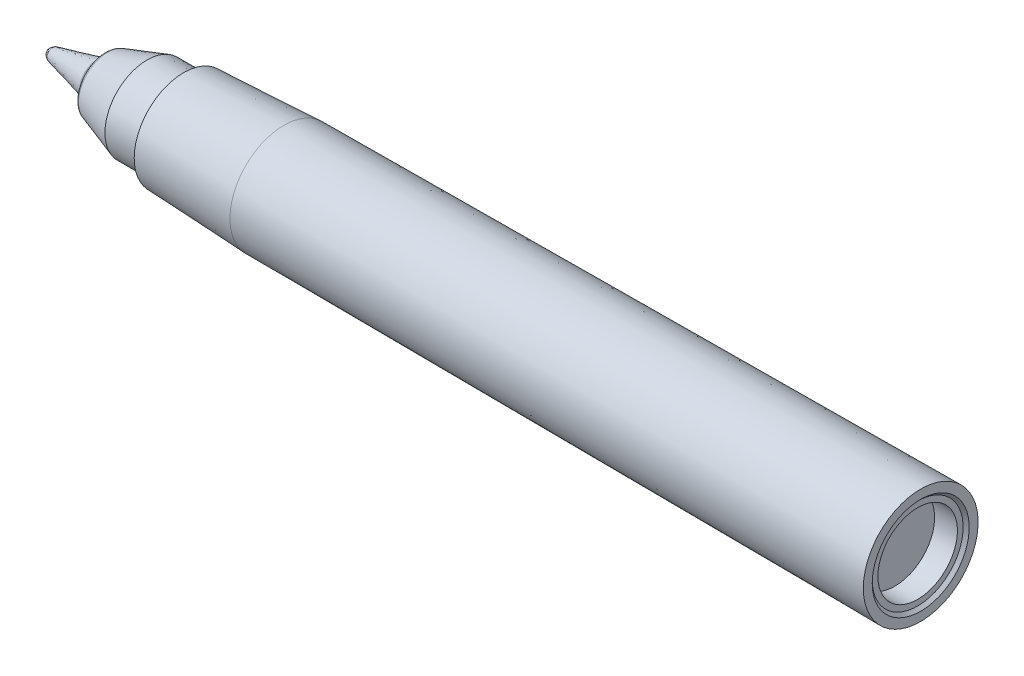
ISO-10303-21;
HEADER;
FILE_DESCRIPTION(('STEP AP214'),'2;1');
FILE_NAME('part.step','',(''),(''),'','','');
FILE_SCHEMA(('AUTOMOTIVE_DESIGN { 1 0 10303 214 1 1 1 1 }'));
ENDSEC;
DATA;
#1=APPLICATION_CONTEXT('core data for automotive mechanical design processes');
#2=APPLICATION_PROTOCOL_DEFINITION('international standard','automotive_design',2000,#1);
#3=PRODUCT_CONTEXT('',#1,'mechanical');
#4=PRODUCT('Part','Part','',(#3));
#5=PRODUCT_RELATED_PRODUCT_CATEGORY('part','',(#4));
#6=PRODUCT_DEFINITION_FORMATION('','',#4);
#7=PRODUCT_DEFINITION_CONTEXT('part definition',#1,'design');
#8=PRODUCT_DEFINITION('design','',#6,#7);
#9=PRODUCT_DEFINITION_SHAPE('','',#8);
#10=(LENGTH_UNIT() NAMED_UNIT(*) SI_UNIT(.MILLI.,.METRE.));
#11=(NAMED_UNIT(*) PLANE_ANGLE_UNIT() SI_UNIT($,.RADIAN.));
#12=(NAMED_UNIT(*) SI_UNIT($,.STERADIAN.) SOLID_ANGLE_UNIT());
#13=UNCERTAINTY_MEASURE_WITH_UNIT(LENGTH_MEASURE(1.E-05),#10,'distance_accuracy_value','');
#14=(GEOMETRIC_REPRESENTATION_CONTEXT(3) GLOBAL_UNCERTAINTY_ASSIGNED_CONTEXT((#13)) GLOBAL_UNIT_ASSIGNED_CONTEXT((#10,
#11,#12)) REPRESENTATION_CONTEXT('',''));
#15=CARTESIAN_POINT('',(0.,0.,0.));
#16=DIRECTION('',(0.,0.,1.));
#17=DIRECTION('',(1.,0.,0.));
#18=AXIS2_PLACEMENT_3D('',#15,#16,#17);
#19=CARTESIAN_POINT('',(8.50261962837269,0.,0.));
#20=DIRECTION('',(-1.,0.,0.));
#21=DIRECTION('',(0.,-1.,0.));
#22=AXIS2_PLACEMENT_3D('',#19,#20,#21);
#23=CYLINDRICAL_SURFACE('',#22,1.09999999999991);
#24=CARTESIAN_POINT('',(8.50261962837794,0.,0.));
#25=DIRECTION('',(-1.,0.,0.));
#26=DIRECTION('',(0.,-1.,0.));
#27=AXIS2_PLACEMENT_3D('',#24,#25,#26);
#28=CIRCLE('',#27,1.09999999999991);
#29=CARTESIAN_POINT('',(8.50261962837794,-1.09999999999991,0.));
#30=VERTEX_POINT('',#29);
#31=EDGE_CURVE('E11',#30,#30,#28,.T.);
#32=ORIENTED_EDGE('',*,*,#31,.F.);
#33=EDGE_LOOP('',(#32));
#34=FACE_BOUND('',#33,.T.);
#35=CARTESIAN_POINT('',(4.51671057128805,0.,0.));
#36=DIRECTION('',(-1.,0.,0.));
#37=DIRECTION('',(0.,-1.,0.));
#38=AXIS2_PLACEMENT_3D('',#35,#36,#37);
#39=CIRCLE('',#38,1.09999999999991);
#40=CARTESIAN_POINT('',(4.51671057128805,-1.09999999999991,0.));
#41=VERTEX_POINT('',#40);
#42=EDGE_CURVE('E94',#41,#41,#39,.T.);
#43=ORIENTED_EDGE('',*,*,#42,.T.);
#44=EDGE_LOOP('',(#43));
#45=FACE_BOUND('',#44,.T.);
#46=ADVANCED_FACE('F49',(#34,#45),#23,.F.);
#47=CARTESIAN_POINT('',(8.50261962837531,0.,0.));
#48=DIRECTION('',(1.,0.,0.));
#49=DIRECTION('',(0.,1.,0.));
#50=AXIS2_PLACEMENT_3D('',#47,#48,#49);
#51=PLANE('',#50);
#52=ORIENTED_EDGE('',*,*,#31,.T.);
#53=EDGE_LOOP('',(#52));
#54=FACE_BOUND('',#53,.T.);
#55=ADVANCED_FACE('F150',(#54),#51,.F.);
#56=CARTESIAN_POINT('',(55.7113816910496,2.61437275918934,0.));
#57=DIRECTION('',(-1.,0.,0.));
#58=DIRECTION('',(0.,-1.,0.));
#59=AXIS2_PLACEMENT_3D('',#56,#57,#58);
#60=PLANE('',#59);
#61=CARTESIAN_POINT('',(55.7113816910496,0.,0.));
#62=DIRECTION('',(-1.,0.,0.));
#63=DIRECTION('',(0.,-1.,0.));
#64=AXIS2_PLACEMENT_3D('',#61,#62,#63);
#65=CIRCLE('',#64,2.61437275918934);
#66=CARTESIAN_POINT('',(55.7113816910496,-2.61437275918934,0.));
#67=VERTEX_POINT('',#66);
#68=EDGE_CURVE('E56',#67,#67,#65,.T.);
#69=ORIENTED_EDGE('',*,*,#68,.F.);
#70=EDGE_LOOP('',(#69));
#71=FACE_BOUND('',#70,.T.);
#72=ADVANCED_FACE('F145',(#71),#60,.F.);
#73=CARTESIAN_POINT('',(55.5113816910399,0.,0.));
#74=DIRECTION('',(-1.,0.,0.));
#75=DIRECTION('',(0.,-1.,0.));
#76=AXIS2_PLACEMENT_3D('',#73,#74,#75);
#77=TOROIDAL_SURFACE('',#76,2.61437275917972,0.200000000009678);
#78=CARTESIAN_POINT('',(55.510774492981,0.,0.));
#79=DIRECTION('',(-1.,0.,0.));
#80=DIRECTION('',(0.,-1.,0.));
#81=AXIS2_PLACEMENT_3D('',#78,#79,#80);
#82=CIRCLE('',#81,2.81437183746357);
#83=CARTESIAN_POINT('',(55.510774492981,-2.81437183746357,0.));
#84=VERTEX_POINT('',#83);
#85=EDGE_CURVE('E62',#84,#84,#82,.T.);
#86=ORIENTED_EDGE('',*,*,#85,.F.);
#87=EDGE_LOOP('',(#86));
#88=FACE_BOUND('',#87,.T.);
#89=ORIENTED_EDGE('',*,*,#68,.T.);
#90=EDGE_LOOP('',(#89));
#91=FACE_BOUND('',#90,.T.);
#92=ADVANCED_FACE('F140',(#88,#91),#77,.T.);
#93=CARTESIAN_POINT('',(55.510774492981,0.,0.));
#94=DIRECTION('',(1.,0.,0.));
#95=DIRECTION('',(0.,1.,0.));
#96=AXIS2_PLACEMENT_3D('',#93,#94,#95);
#97=CONICAL_SURFACE('',#96,2.81437183746357,0.00422017130486288);
#98=CARTESIAN_POINT('',(31.133148246512,0.,0.));
#99=DIRECTION('',(-1.,0.,0.));
#100=DIRECTION('',(0.,-1.,0.));
#101=AXIS2_PLACEMENT_3D('',#98,#99,#100);
#102=CIRCLE('',#101,2.71149346794752);
#103=CARTESIAN_POINT('',(31.133148246512,-2.71149346794752,0.));
#104=VERTEX_POINT('',#103);
#105=EDGE_CURVE('E68',#104,#104,#102,.T.);
#106=ORIENTED_EDGE('',*,*,#105,.F.);
#107=EDGE_LOOP('',(#106));
#108=FACE_BOUND('',#107,.T.);
#109=ORIENTED_EDGE('',*,*,#85,.T.);
#110=EDGE_LOOP('',(#109));
#111=FACE_BOUND('',#110,.T.);
#112=ADVANCED_FACE('F134',(#108,#111),#97,.T.);
#113=CARTESIAN_POINT('',(25.5505978630776,0.,0.));
#114=DIRECTION('',(-1.,0.,0.));
#115=DIRECTION('',(0.,-1.,0.));
#116=AXIS2_PLACEMENT_3D('',#113,#114,#115);
#117=DEGENERATE_TOROIDAL_SURFACE('',#116,318.3748413353,321.13486149306,.F.);
#118=CARTESIAN_POINT('',(10.9274143015883,0.,0.));
#119=DIRECTION('',(-1.,0.,0.));
#120=DIRECTION('',(0.,-1.,0.));
#121=AXIS2_PLACEMENT_3D('',#118,#119,#120);
#122=CIRCLE('',#121,2.42690705253801);
#123=CARTESIAN_POINT('',(10.9274143015883,-2.42690705253801,0.));
#124=VERTEX_POINT('',#123);
#125=EDGE_CURVE('E74',#124,#124,#122,.T.);
#126=ORIENTED_EDGE('',*,*,#125,.F.);
#127=EDGE_LOOP('',(#126));
#128=FACE_BOUND('',#127,.T.);
#129=ORIENTED_EDGE('',*,*,#105,.T.);
#130=EDGE_LOOP('',(#129));
#131=FACE_BOUND('',#130,.T.);
#132=ADVANCED_FACE('F128',(#128,#131),#117,.F.);
#133=CARTESIAN_POINT('',(8.50261962837269,0.,0.));
#134=DIRECTION('',(-1.,0.,0.));
#135=DIRECTION('',(0.,-1.,0.));
#136=AXIS2_PLACEMENT_3D('',#133,#134,#135);
#137=CYLINDRICAL_SURFACE('',#136,2.42690705253955);
#138=CARTESIAN_POINT('',(9.70052193133052,0.,0.));
#139=DIRECTION('',(-1.,0.,0.));
#140=DIRECTION('',(0.,-1.,0.));
#141=AXIS2_PLACEMENT_3D('',#138,#139,#140);
#142=CIRCLE('',#141,2.42690705254109);
#143=CARTESIAN_POINT('',(9.70052193133052,-2.42690705254109,0.));
#144=VERTEX_POINT('',#143);
#145=EDGE_CURVE('E78',#144,#144,#142,.T.);
#146=ORIENTED_EDGE('',*,*,#145,.F.);
#147=EDGE_LOOP('',(#146));
#148=FACE_BOUND('',#147,.T.);
#149=ORIENTED_EDGE('',*,*,#125,.T.);
#150=EDGE_LOOP('',(#149));
#151=FACE_BOUND('',#150,.T.);
#152=ADVANCED_FACE('F122',(#148,#151),#137,.T.);
#153=CARTESIAN_POINT('',(9.70052193133052,2.19852355134617,0.));
#154=DIRECTION('',(1.,0.,0.));
#155=DIRECTION('',(0.,1.,0.));
#156=AXIS2_PLACEMENT_3D('',#153,#154,#155);
#157=PLANE('',#156);
#158=CARTESIAN_POINT('',(9.70052193133052,0.,0.));
#159=DIRECTION('',(-1.,0.,0.));
#160=DIRECTION('',(0.,-1.,0.));
#161=AXIS2_PLACEMENT_3D('',#158,#159,#160);
#162=CIRCLE('',#161,2.19852355134617);
#163=CARTESIAN_POINT('',(9.70052193133052,-2.19852355134617,0.));
#164=VERTEX_POINT('',#163);
#165=EDGE_CURVE('E82',#164,#164,#162,.T.);
#166=ORIENTED_EDGE('',*,*,#165,.F.);
#167=EDGE_LOOP('',(#166));
#168=FACE_BOUND('',#167,.T.);
#169=ORIENTED_EDGE('',*,*,#145,.T.);
#170=EDGE_LOOP('',(#169));
#171=FACE_BOUND('',#170,.T.);
#172=ADVANCED_FACE('F116',(#168,#171),#157,.F.);
#173=CARTESIAN_POINT('',(8.50261962837269,0.,0.));
#174=DIRECTION('',(-1.,0.,0.));
#175=DIRECTION('',(0.,-1.,0.));
#176=AXIS2_PLACEMENT_3D('',#173,#174,#175);
#177=CYLINDRICAL_SURFACE('',#176,2.19852355134617);
#178=CARTESIAN_POINT('',(6.95810440082095,0.,0.));
#179=DIRECTION('',(-1.,0.,0.));
#180=DIRECTION('',(0.,-1.,0.));
#181=AXIS2_PLACEMENT_3D('',#178,#179,#180);
#182=CIRCLE('',#181,2.19852355134617);
#183=CARTESIAN_POINT('',(6.95810440082095,-2.19852355134617,0.));
#184=VERTEX_POINT('',#183);
#185=EDGE_CURVE('E86',#184,#184,#182,.T.);
#186=ORIENTED_EDGE('',*,*,#185,.F.);
#187=EDGE_LOOP('',(#186));
#188=FACE_BOUND('',#187,.T.);
#189=ORIENTED_EDGE('',*,*,#165,.T.);
#190=EDGE_LOOP('',(#189));
#191=FACE_BOUND('',#190,.T.);
#192=ADVANCED_FACE('F110',(#188,#191),#177,.T.);
#193=CARTESIAN_POINT('',(6.95810440082095,0.,0.));
#194=DIRECTION('',(1.,0.,0.));
#195=DIRECTION('',(0.,1.,0.));
#196=AXIS2_PLACEMENT_3D('',#193,#194,#195);
#197=CONICAL_SURFACE('',#196,2.19852355134617,0.35208343751288);
#198=CARTESIAN_POINT('',(4.51671057128805,0.,0.));
#199=DIRECTION('',(-1.,0.,0.));
#200=DIRECTION('',(0.,-1.,0.));
#201=AXIS2_PLACEMENT_3D('',#198,#199,#200);
#202=CIRCLE('',#201,1.30157659585847);
#203=CARTESIAN_POINT('',(4.51671057128805,-1.30157659585847,0.));
#204=VERTEX_POINT('',#203);
#205=EDGE_CURVE('E90',#204,#204,#202,.T.);
#206=ORIENTED_EDGE('',*,*,#205,.F.);
#207=EDGE_LOOP('',(#206));
#208=FACE_BOUND('',#207,.T.);
#209=ORIENTED_EDGE('',*,*,#185,.T.);
#210=EDGE_LOOP('',(#209));
#211=FACE_BOUND('',#210,.T.);
#212=ADVANCED_FACE('F104',(#208,#211),#197,.T.);
#213=CARTESIAN_POINT('',(4.51671057128805,1.09999999999991,0.));
#214=DIRECTION('',(1.,0.,0.));
#215=DIRECTION('',(0.,1.,0.));
#216=AXIS2_PLACEMENT_3D('',#213,#214,#215);
#217=PLANE('',#216);
#218=ORIENTED_EDGE('',*,*,#42,.F.);
#219=EDGE_LOOP('',(#218));
#220=FACE_BOUND('',#219,.T.);
#221=ORIENTED_EDGE('',*,*,#205,.T.);
#222=EDGE_LOOP('',(#221));
#223=FACE_BOUND('',#222,.T.);
#224=ADVANCED_FACE('F101',(#220,#223),#217,.F.);
#225=CLOSED_SHELL('',(#46,#55,#72,#92,#112,#132,#152,#172,#192,#212,#224));
#226=MANIFOLD_SOLID_BREP('B2',#225);
#227=CARTESIAN_POINT('',(3.71138169106612,1.63313727629748,0.));
#228=DIRECTION('',(1.,0.,0.));
#229=DIRECTION('',(0.,0.,-1.));
#230=AXIS2_PLACEMENT_3D('',#227,#228,#229);
#231=PLANE('',#230);
#232=CARTESIAN_POINT('',(3.71138169104961,0.,0.));
#233=DIRECTION('',(-1.,0.,0.));
#234=DIRECTION('',(0.,0.,1.));
#235=AXIS2_PLACEMENT_3D('',#232,#233,#234);
#236=CIRCLE('',#235,1.09999999999991);
#237=CARTESIAN_POINT('',(3.71138169104961,0.,1.09999999999991));
#238=VERTEX_POINT('',#237);
#239=EDGE_CURVE('E345',#238,#238,#236,.T.);
#240=ORIENTED_EDGE('',*,*,#239,.F.);
#241=EDGE_LOOP('',(#240));
#242=FACE_BOUND('',#241,.T.);
#243=CARTESIAN_POINT('',(3.71138169108264,0.,0.));
#244=DIRECTION('',(-1.,0.,0.));
#245=DIRECTION('',(0.,0.,1.));
#246=AXIS2_PLACEMENT_3D('',#243,#244,#245);
#247=CIRCLE('',#246,1.63313727629748);
#248=CARTESIAN_POINT('',(3.71138169108264,0.,1.63313727629748));
#249=VERTEX_POINT('',#248);
#250=EDGE_CURVE('E48',#249,#249,#247,.T.);
#251=ORIENTED_EDGE('',*,*,#250,.T.);
#252=EDGE_LOOP('',(#251));
#253=FACE_BOUND('',#252,.T.);
#254=ADVANCED_FACE('F260',(#242,#253),#231,.F.);
#255=CARTESIAN_POINT('',(4.01138169108235,0.,0.));
#256=DIRECTION('',(-1.,0.,0.));
#257=DIRECTION('',(0.,0.,1.));
#258=AXIS2_PLACEMENT_3D('',#255,#256,#257);
#259=TOROIDAL_SURFACE('',#258,1.63313727629763,0.299999999999717);
#260=ORIENTED_EDGE('',*,*,#250,.F.);
#261=EDGE_LOOP('',(#260));
#262=FACE_BOUND('',#261,.T.);
#263=CARTESIAN_POINT('',(3.91727671553044,0.,0.));
#264=DIRECTION('',(-1.,0.,0.));
#265=DIRECTION('',(0.,0.,1.));
#266=AXIS2_PLACEMENT_3D('',#263,#264,#265);
#267=CIRCLE('',#266,1.91799558068106);
#268=CARTESIAN_POINT('',(3.91727671553044,0.,1.91799558068106));
#269=VERTEX_POINT('',#268);
#270=EDGE_CURVE('E267',#269,#269,#267,.T.);
#271=ORIENTED_EDGE('',*,*,#270,.T.);
#272=EDGE_LOOP('',(#271));
#273=FACE_BOUND('',#272,.T.);
#274=ADVANCED_FACE('F354',(#262,#273),#259,.T.);
#275=CARTESIAN_POINT('',(6.51138169111982,0.,0.));
#276=DIRECTION('',(1.,0.,0.));
#277=DIRECTION('',(0.,0.,-1.));
#278=AXIS2_PLACEMENT_3D('',#275,#276,#277);
#279=CONICAL_SURFACE('',#278,2.77497668867727,0.319069595668549);
#280=ORIENTED_EDGE('',*,*,#270,.F.);
#281=EDGE_LOOP('',(#280));
#282=FACE_BOUND('',#281,.T.);
#283=CARTESIAN_POINT('',(6.51138169111982,0.,0.));
#284=DIRECTION('',(-1.,0.,0.));
#285=DIRECTION('',(0.,0.,1.));
#286=AXIS2_PLACEMENT_3D('',#283,#284,#285);
#287=CIRCLE('',#286,2.77497668867727);
#288=CARTESIAN_POINT('',(6.51138169111982,0.,2.77497668867727));
#289=VERTEX_POINT('',#288);
#290=EDGE_CURVE('E273',#289,#289,#287,.T.);
#291=ORIENTED_EDGE('',*,*,#290,.T.);
#292=EDGE_LOOP('',(#291));
#293=FACE_BOUND('',#292,.T.);
#294=ADVANCED_FACE('F358',(#282,#293),#279,.T.);
#295=CARTESIAN_POINT('',(8.91138169108489,0.,0.));
#296=DIRECTION('',(1.,0.,0.));
#297=DIRECTION('',(0.,0.,-1.));
#298=AXIS2_PLACEMENT_3D('',#295,#296,#297);
#299=CONICAL_SURFACE('',#298,2.7899766886776,0.00624991862192917);
#300=ORIENTED_EDGE('',*,*,#290,.F.);
#301=EDGE_LOOP('',(#300));
#302=FACE_BOUND('',#301,.T.);
#303=CARTESIAN_POINT('',(8.91138169108489,0.,0.));
#304=DIRECTION('',(-1.,0.,0.));
#305=DIRECTION('',(0.,0.,1.));
#306=AXIS2_PLACEMENT_3D('',#303,#304,#305);
#307=CIRCLE('',#306,2.7899766886776);
#308=CARTESIAN_POINT('',(8.91138169108489,0.,2.7899766886776));
#309=VERTEX_POINT('',#308);
#310=EDGE_CURVE('E279',#309,#309,#307,.T.);
#311=ORIENTED_EDGE('',*,*,#310,.T.);
#312=EDGE_LOOP('',(#311));
#313=FACE_BOUND('',#312,.T.);
#314=ADVANCED_FACE('F363',(#302,#313),#299,.T.);
#315=CARTESIAN_POINT('',(8.91138169108489,3.24997668867763,0.));
#316=DIRECTION('',(1.,0.,0.));
#317=DIRECTION('',(0.,0.,-1.));
#318=AXIS2_PLACEMENT_3D('',#315,#316,#317);
#319=PLANE('',#318);
#320=ORIENTED_EDGE('',*,*,#310,.F.);
#321=EDGE_LOOP('',(#320));
#322=FACE_BOUND('',#321,.T.);
#323=CARTESIAN_POINT('',(8.91138169108489,0.,0.));
#324=DIRECTION('',(-1.,0.,0.));
#325=DIRECTION('',(0.,0.,1.));
#326=AXIS2_PLACEMENT_3D('',#323,#324,#325);
#327=CIRCLE('',#326,3.24997668867763);
#328=CARTESIAN_POINT('',(8.91138169108489,0.,3.24997668867763));
#329=VERTEX_POINT('',#328);
#330=EDGE_CURVE('E285',#329,#329,#327,.T.);
#331=ORIENTED_EDGE('',*,*,#330,.T.);
#332=EDGE_LOOP('',(#331));
#333=FACE_BOUND('',#332,.T.);
#334=ADVANCED_FACE('F369',(#322,#333),#319,.F.);
#335=CARTESIAN_POINT('',(15.5113816910853,0.,0.));
#336=DIRECTION('',(1.,0.,0.));
#337=DIRECTION('',(0.,0.,-1.));
#338=AXIS2_PLACEMENT_3D('',#335,#336,#337);
#339=CONICAL_SURFACE('',#338,3.54997668867828,0.0454232794216723);
#340=ORIENTED_EDGE('',*,*,#330,.F.);
#341=EDGE_LOOP('',(#340));
#342=FACE_BOUND('',#341,.T.);
#343=CARTESIAN_POINT('',(15.5113816910853,0.,0.));
#344=DIRECTION('',(-1.,0.,0.));
#345=DIRECTION('',(0.,0.,1.));
#346=AXIS2_PLACEMENT_3D('',#343,#344,#345);
#347=CIRCLE('',#346,3.54997668867828);
#348=CARTESIAN_POINT('',(15.5113816910853,0.,3.54997668867828));
#349=VERTEX_POINT('',#348);
#350=EDGE_CURVE('E289',#349,#349,#347,.T.);
#351=ORIENTED_EDGE('',*,*,#350,.T.);
#352=EDGE_LOOP('',(#351));
#353=FACE_BOUND('',#352,.T.);
#354=ADVANCED_FACE('F373',(#342,#353),#339,.T.);
#355=CARTESIAN_POINT('',(57.4113816910467,0.,0.));
#356=DIRECTION('',(1.,0.,0.));
#357=DIRECTION('',(0.,0.,-1.));
#358=AXIS2_PLACEMENT_3D('',#355,#356,#357);
#359=CONICAL_SURFACE('',#358,3.77605582537217,0.00539563109200447);
#360=ORIENTED_EDGE('',*,*,#350,.F.);
#361=EDGE_LOOP('',(#360));
#362=FACE_BOUND('',#361,.T.);
#363=CARTESIAN_POINT('',(57.4113816910467,0.,0.));
#364=DIRECTION('',(-1.,0.,0.));
#365=DIRECTION('',(0.,0.,1.));
#366=AXIS2_PLACEMENT_3D('',#363,#364,#365);
#367=CIRCLE('',#366,3.77605582537217);
#368=CARTESIAN_POINT('',(57.4113816910467,0.,3.77605582537217));
#369=VERTEX_POINT('',#368);
#370=EDGE_CURVE('E293',#369,#369,#367,.T.);
#371=ORIENTED_EDGE('',*,*,#370,.T.);
#372=EDGE_LOOP('',(#371));
#373=FACE_BOUND('',#372,.T.);
#374=ADVANCED_FACE('F377',(#362,#373),#359,.T.);
#375=CARTESIAN_POINT('',(57.4113816910451,3.19137086155206,0.));
#376=DIRECTION('',(-1.,0.,0.));
#377=DIRECTION('',(0.,0.,1.));
#378=AXIS2_PLACEMENT_3D('',#375,#376,#377);
#379=PLANE('',#378);
#380=ORIENTED_EDGE('',*,*,#370,.F.);
#381=EDGE_LOOP('',(#380));
#382=FACE_BOUND('',#381,.T.);
#383=CARTESIAN_POINT('',(57.4113816910435,0.,0.));
#384=DIRECTION('',(-1.,0.,0.));
#385=DIRECTION('',(0.,0.,1.));
#386=AXIS2_PLACEMENT_3D('',#383,#384,#385);
#387=CIRCLE('',#386,3.19137086155206);
#388=CARTESIAN_POINT('',(57.4113816910435,0.,3.19137086155206));
#389=VERTEX_POINT('',#388);
#390=EDGE_CURVE('E297',#389,#389,#387,.T.);
#391=ORIENTED_EDGE('',*,*,#390,.T.);
#392=EDGE_LOOP('',(#391));
#393=FACE_BOUND('',#392,.T.);
#394=ADVANCED_FACE('F381',(#382,#393),#379,.F.);
#395=CARTESIAN_POINT('',(57.2113816910496,0.,0.));
#396=DIRECTION('',(1.,0.,0.));
#397=DIRECTION('',(0.,0.,-1.));
#398=AXIS2_PLACEMENT_3D('',#395,#396,#397);
#399=CONICAL_SURFACE('',#398,2.99137086155815,0.785398163397483);
#400=ORIENTED_EDGE('',*,*,#390,.F.);
#401=EDGE_LOOP('',(#400));
#402=FACE_BOUND('',#401,.T.);
#403=CARTESIAN_POINT('',(57.2113816910496,0.,0.));
#404=DIRECTION('',(-1.,0.,0.));
#405=DIRECTION('',(0.,0.,1.));
#406=AXIS2_PLACEMENT_3D('',#403,#404,#405);
#407=CIRCLE('',#406,2.99137086155815);
#408=CARTESIAN_POINT('',(57.2113816910496,0.,2.99137086155815));
#409=VERTEX_POINT('',#408);
#410=EDGE_CURVE('E301',#409,#409,#407,.T.);
#411=ORIENTED_EDGE('',*,*,#410,.T.);
#412=EDGE_LOOP('',(#411));
#413=FACE_BOUND('',#412,.T.);
#414=ADVANCED_FACE('F385',(#402,#413),#399,.F.);
#415=CARTESIAN_POINT('',(57.2113816910496,2.61437275918934,0.));
#416=DIRECTION('',(-1.,0.,0.));
#417=DIRECTION('',(0.,0.,1.));
#418=AXIS2_PLACEMENT_3D('',#415,#416,#417);
#419=PLANE('',#418);
#420=ORIENTED_EDGE('',*,*,#410,.F.);
#421=EDGE_LOOP('',(#420));
#422=FACE_BOUND('',#421,.T.);
#423=CARTESIAN_POINT('',(57.2113816910496,0.,0.));
#424=DIRECTION('',(-1.,0.,0.));
#425=DIRECTION('',(0.,0.,1.));
#426=AXIS2_PLACEMENT_3D('',#423,#424,#425);
#427=CIRCLE('',#426,2.61437275918934);
#428=CARTESIAN_POINT('',(57.2113816910496,0.,2.61437275918934));
#429=VERTEX_POINT('',#428);
#430=EDGE_CURVE('E305',#429,#429,#427,.T.);
#431=ORIENTED_EDGE('',*,*,#430,.T.);
#432=EDGE_LOOP('',(#431));
#433=FACE_BOUND('',#432,.T.);
#434=ADVANCED_FACE('F389',(#422,#433),#419,.F.);
#435=CARTESIAN_POINT('',(0.,0.,0.));
#436=DIRECTION('',(-1.,0.,0.));
#437=DIRECTION('',(0.,0.,1.));
#438=AXIS2_PLACEMENT_3D('',#435,#436,#437);
#439=CYLINDRICAL_SURFACE('',#438,2.61437275918934);
#440=ORIENTED_EDGE('',*,*,#430,.F.);
#441=EDGE_LOOP('',(#440));
#442=FACE_BOUND('',#441,.T.);
#443=CARTESIAN_POINT('',(55.7113816910496,0.,0.));
#444=DIRECTION('',(-1.,0.,0.));
#445=DIRECTION('',(0.,0.,1.));
#446=AXIS2_PLACEMENT_3D('',#443,#444,#445);
#447=CIRCLE('',#446,2.61437275918934);
#448=CARTESIAN_POINT('',(55.7113816910496,0.,2.61437275918934));
#449=VERTEX_POINT('',#448);
#450=EDGE_CURVE('E309',#449,#449,#447,.T.);
#451=ORIENTED_EDGE('',*,*,#450,.T.);
#452=EDGE_LOOP('',(#451));
#453=FACE_BOUND('',#452,.T.);
#454=ADVANCED_FACE('F393',(#442,#453),#439,.F.);
#455=CARTESIAN_POINT('',(55.5113816910399,0.,0.));
#456=DIRECTION('',(-1.,0.,0.));
#457=DIRECTION('',(0.,0.,1.));
#458=AXIS2_PLACEMENT_3D('',#455,#456,#457);
#459=TOROIDAL_SURFACE('',#458,2.61437275917972,0.200000000009678);
#460=ORIENTED_EDGE('',*,*,#450,.F.);
#461=EDGE_LOOP('',(#460));
#462=FACE_BOUND('',#461,.T.);
#463=CARTESIAN_POINT('',(55.510774492981,0.,0.));
#464=DIRECTION('',(-1.,0.,0.));
#465=DIRECTION('',(0.,0.,1.));
#466=AXIS2_PLACEMENT_3D('',#463,#464,#465);
#467=CIRCLE('',#466,2.81437183746357);
#468=CARTESIAN_POINT('',(55.510774492981,0.,2.81437183746357));
#469=VERTEX_POINT('',#468);
#470=EDGE_CURVE('E313',#469,#469,#467,.T.);
#471=ORIENTED_EDGE('',*,*,#470,.T.);
#472=EDGE_LOOP('',(#471));
#473=FACE_BOUND('',#472,.T.);
#474=ADVANCED_FACE('F397',(#462,#473),#459,.F.);
#475=CARTESIAN_POINT('',(31.1331482465121,0.,0.));
#476=DIRECTION('',(1.,0.,0.));
#477=DIRECTION('',(0.,0.,-1.));
#478=AXIS2_PLACEMENT_3D('',#475,#476,#477);
#479=CONICAL_SURFACE('',#478,2.71149346794436,0.00422017130499267);
#480=ORIENTED_EDGE('',*,*,#470,.F.);
#481=EDGE_LOOP('',(#480));
#482=FACE_BOUND('',#481,.T.);
#483=CARTESIAN_POINT('',(31.1331482465121,0.,0.));
#484=DIRECTION('',(-1.,0.,0.));
#485=DIRECTION('',(0.,0.,1.));
#486=AXIS2_PLACEMENT_3D('',#483,#484,#485);
#487=CIRCLE('',#486,2.71149346794436);
#488=CARTESIAN_POINT('',(31.1331482465121,0.,2.71149346794436));
#489=VERTEX_POINT('',#488);
#490=EDGE_CURVE('E317',#489,#489,#487,.T.);
#491=ORIENTED_EDGE('',*,*,#490,.T.);
#492=EDGE_LOOP('',(#491));
#493=FACE_BOUND('',#492,.T.);
#494=ADVANCED_FACE('F401',(#482,#493),#479,.F.);
#495=CARTESIAN_POINT('',(25.5505978630776,0.,0.));
#496=DIRECTION('',(-1.,0.,0.));
#497=DIRECTION('',(0.,0.,1.));
#498=AXIS2_PLACEMENT_3D('',#495,#496,#497);
#499=DEGENERATE_TOROIDAL_SURFACE('',#498,318.3748413353,321.13486149306,.F.);
#500=ORIENTED_EDGE('',*,*,#490,.F.);
#501=EDGE_LOOP('',(#500));
#502=FACE_BOUND('',#501,.T.);
#503=CARTESIAN_POINT('',(10.9274143015883,0.,0.));
#504=DIRECTION('',(-1.,0.,0.));
#505=DIRECTION('',(0.,0.,1.));
#506=AXIS2_PLACEMENT_3D('',#503,#504,#505);
#507=CIRCLE('',#506,2.42690705253801);
#508=CARTESIAN_POINT('',(10.9274143015883,0.,2.42690705253801));
#509=VERTEX_POINT('',#508);
#510=EDGE_CURVE('E321',#509,#509,#507,.T.);
#511=ORIENTED_EDGE('',*,*,#510,.T.);
#512=EDGE_LOOP('',(#511));
#513=FACE_BOUND('',#512,.T.);
#514=ADVANCED_FACE('F405',(#502,#513),#499,.T.);
#515=CARTESIAN_POINT('',(0.,0.,0.));
#516=DIRECTION('',(-1.,0.,0.));
#517=DIRECTION('',(0.,0.,1.));
#518=AXIS2_PLACEMENT_3D('',#515,#516,#517);
#519=CYLINDRICAL_SURFACE('',#518,2.42690705253955);
#520=ORIENTED_EDGE('',*,*,#510,.F.);
#521=EDGE_LOOP('',(#520));
#522=FACE_BOUND('',#521,.T.);
#523=CARTESIAN_POINT('',(9.70052193133052,0.,0.));
#524=DIRECTION('',(-1.,0.,0.));
#525=DIRECTION('',(0.,0.,1.));
#526=AXIS2_PLACEMENT_3D('',#523,#524,#525);
#527=CIRCLE('',#526,2.42690705254109);
#528=CARTESIAN_POINT('',(9.70052193133052,0.,2.42690705254109));
#529=VERTEX_POINT('',#528);
#530=EDGE_CURVE('E325',#529,#529,#527,.T.);
#531=ORIENTED_EDGE('',*,*,#530,.T.);
#532=EDGE_LOOP('',(#531));
#533=FACE_BOUND('',#532,.T.);
#534=ADVANCED_FACE('F409',(#522,#533),#519,.F.);
#535=CARTESIAN_POINT('',(9.70052193133052,2.19852355134617,0.));
#536=DIRECTION('',(-1.,0.,0.));
#537=DIRECTION('',(0.,0.,1.));
#538=AXIS2_PLACEMENT_3D('',#535,#536,#537);
#539=PLANE('',#538);
#540=ORIENTED_EDGE('',*,*,#530,.F.);
#541=EDGE_LOOP('',(#540));
#542=FACE_BOUND('',#541,.T.);
#543=CARTESIAN_POINT('',(9.70052193133052,0.,0.));
#544=DIRECTION('',(-1.,0.,0.));
#545=DIRECTION('',(0.,0.,1.));
#546=AXIS2_PLACEMENT_3D('',#543,#544,#545);
#547=CIRCLE('',#546,2.19852355134617);
#548=CARTESIAN_POINT('',(9.70052193133052,0.,2.19852355134617));
#549=VERTEX_POINT('',#548);
#550=EDGE_CURVE('E329',#549,#549,#547,.T.);
#551=ORIENTED_EDGE('',*,*,#550,.T.);
#552=EDGE_LOOP('',(#551));
#553=FACE_BOUND('',#552,.T.);
#554=ADVANCED_FACE('F413',(#542,#553),#539,.F.);
#555=CARTESIAN_POINT('',(0.,0.,0.));
#556=DIRECTION('',(-1.,0.,0.));
#557=DIRECTION('',(0.,0.,1.));
#558=AXIS2_PLACEMENT_3D('',#555,#556,#557);
#559=CYLINDRICAL_SURFACE('',#558,2.19852355134617);
#560=ORIENTED_EDGE('',*,*,#550,.F.);
#561=EDGE_LOOP('',(#560));
#562=FACE_BOUND('',#561,.T.);
#563=CARTESIAN_POINT('',(6.95810440082095,0.,0.));
#564=DIRECTION('',(-1.,0.,0.));
#565=DIRECTION('',(0.,0.,1.));
#566=AXIS2_PLACEMENT_3D('',#563,#564,#565);
#567=CIRCLE('',#566,2.19852355134617);
#568=CARTESIAN_POINT('',(6.95810440082095,0.,2.19852355134617));
#569=VERTEX_POINT('',#568);
#570=EDGE_CURVE('E333',#569,#569,#567,.T.);
#571=ORIENTED_EDGE('',*,*,#570,.T.);
#572=EDGE_LOOP('',(#571));
#573=FACE_BOUND('',#572,.T.);
#574=ADVANCED_FACE('F417',(#562,#573),#559,.F.);
#575=CARTESIAN_POINT('',(4.51671057128805,0.,0.));
#576=DIRECTION('',(1.,0.,0.));
#577=DIRECTION('',(0.,0.,-1.));
#578=AXIS2_PLACEMENT_3D('',#575,#576,#577);
#579=CONICAL_SURFACE('',#578,1.30157659585847,0.35208343751288);
#580=ORIENTED_EDGE('',*,*,#570,.F.);
#581=EDGE_LOOP('',(#580));
#582=FACE_BOUND('',#581,.T.);
#583=CARTESIAN_POINT('',(4.51671057128805,0.,0.));
#584=DIRECTION('',(-1.,0.,0.));
#585=DIRECTION('',(0.,0.,1.));
#586=AXIS2_PLACEMENT_3D('',#583,#584,#585);
#587=CIRCLE('',#586,1.30157659585847);
#588=CARTESIAN_POINT('',(4.51671057128805,0.,1.30157659585847));
#589=VERTEX_POINT('',#588);
#590=EDGE_CURVE('E337',#589,#589,#587,.T.);
#591=ORIENTED_EDGE('',*,*,#590,.T.);
#592=EDGE_LOOP('',(#591));
#593=FACE_BOUND('',#592,.T.);
#594=ADVANCED_FACE('F421',(#582,#593),#579,.F.);
#595=CARTESIAN_POINT('',(4.51671057128805,1.09999999999991,0.));
#596=DIRECTION('',(-1.,0.,0.));
#597=DIRECTION('',(0.,0.,1.));
#598=AXIS2_PLACEMENT_3D('',#595,#596,#597);
#599=PLANE('',#598);
#600=ORIENTED_EDGE('',*,*,#590,.F.);
#601=EDGE_LOOP('',(#600));
#602=FACE_BOUND('',#601,.T.);
#603=CARTESIAN_POINT('',(4.51671057128805,0.,0.));
#604=DIRECTION('',(-1.,0.,0.));
#605=DIRECTION('',(0.,0.,1.));
#606=AXIS2_PLACEMENT_3D('',#603,#604,#605);
#607=CIRCLE('',#606,1.09999999999991);
#608=CARTESIAN_POINT('',(4.51671057128805,0.,1.09999999999991));
#609=VERTEX_POINT('',#608);
#610=EDGE_CURVE('E341',#609,#609,#607,.T.);
#611=ORIENTED_EDGE('',*,*,#610,.T.);
#612=EDGE_LOOP('',(#611));
#613=FACE_BOUND('',#612,.T.);
#614=ADVANCED_FACE('F425',(#602,#613),#599,.F.);
#615=CARTESIAN_POINT('',(0.,0.,0.));
#616=DIRECTION('',(-1.,0.,0.));
#617=DIRECTION('',(0.,0.,1.));
#618=AXIS2_PLACEMENT_3D('',#615,#616,#617);
#619=CYLINDRICAL_SURFACE('',#618,1.09999999999991);
#620=ORIENTED_EDGE('',*,*,#610,.F.);
#621=EDGE_LOOP('',(#620));
#622=FACE_BOUND('',#621,.T.);
#623=ORIENTED_EDGE('',*,*,#239,.T.);
#624=EDGE_LOOP('',(#623));
#625=FACE_BOUND('',#624,.T.);
#626=ADVANCED_FACE('F351',(#622,#625),#619,.F.);
#627=CLOSED_SHELL('',(#254,#274,#294,#314,#334,#354,#374,#394,#414,#434,#454,#474,#494,#514,
#534,#554,#574,#594,#614,#626));
#628=MANIFOLD_SOLID_BREP('B6',#627);
#629=CARTESIAN_POINT('',(3.17963793760437,1.09415896780346,0.));
#630=CARTESIAN_POINT('',(1.7695728366805,0.745755337845193,0.));
#631=CARTESIAN_POINT('',(0.336657651920298,0.394881535432582,0.));
#632=CARTESIAN_POINT('',(0.300391978724437,0.386001264791087,0.));
#633=CARTESIAN_POINT('',(0.277694333652377,0.358751369697929,0.));
#634=CARTESIAN_POINT('',(0.272952880074452,0.353058968038673,0.));
#635=CARTESIAN_POINT('',(0.265895067686872,0.347116160044611,0.));
#636=(BOUNDED_CURVE() B_SPLINE_CURVE(2,(#629,#630,#631,#632,#633,#634,#635),.UNSPECIFIED.,.F.,
.F.) B_SPLINE_CURVE_WITH_KNOTS((3,2,2,3),(0.,0.96346260590031,0.99233145808713,1.),
.UNSPECIFIED.) CURVE() GEOMETRIC_REPRESENTATION_ITEM() RATIONAL_B_SPLINE_CURVE((1.,1.,1.,
0.946181298874506,1.,1.,1.)) REPRESENTATION_ITEM(''));
#637=CARTESIAN_POINT('',(-3.04333851307184E-05,-2.3311317362551E-05,0.));
#638=DIRECTION('',(-0.999999999996242,-2.74165315438486E-06,0.));
#639=AXIS1_PLACEMENT('',#637,#638);
#640=SURFACE_OF_REVOLUTION('',#636,#639);
#641=CARTESIAN_POINT('',(0.2658960194209,-2.25822392643782E-05,0.));
#642=DIRECTION('',(-0.999999999996242,-2.74165315438486E-06,0.));
#643=DIRECTION('',(2.74165315438486E-06,-0.999999999996242,0.));
#644=AXIS2_PLACEMENT_3D('',#641,#642,#643);
#645=CIRCLE('',#644,0.34713874228518);
#646=CARTESIAN_POINT('',(0.265896971154928,-0.34716132452314,0.));
#647=VERTEX_POINT('',#646);
#648=EDGE_CURVE('E258',#647,#647,#645,.T.);
#649=ORIENTED_EDGE('',*,*,#648,.F.);
#650=EDGE_LOOP('',(#649));
#651=FACE_BOUND('',#650,.T.);
#652=CARTESIAN_POINT('',(3.17964093744876,-1.45937613187642E-05,0.));
#653=DIRECTION('',(-0.999999999996242,-2.74165315438486E-06,0.));
#654=DIRECTION('',(2.74165315438486E-06,-0.999999999996242,0.));
#655=AXIS2_PLACEMENT_3D('',#652,#653,#654);
#656=CIRCLE('',#655,1.09417356156889);
#657=CARTESIAN_POINT('',(3.17964393729316,-1.0941881553261,0.));
#658=VERTEX_POINT('',#657);
#659=EDGE_CURVE('E713',#658,#658,#656,.T.);
#660=ORIENTED_EDGE('',*,*,#659,.T.);
#661=EDGE_LOOP('',(#660));
#662=FACE_BOUND('',#661,.T.);
#663=ADVANCED_FACE('F692',(#651,#662),#640,.T.);
#664=CARTESIAN_POINT('',(0.265895067686872,0.347116160044611,0.));
#665=CARTESIAN_POINT('',(-7.81059321113418E-06,0.258033040073059,0.));
#666=CARTESIAN_POINT('',(-3.04333851307184E-05,-2.3311317362551E-05,0.));
#667=(BOUNDED_CURVE() B_SPLINE_CURVE(2,(#664,#665,#666),.UNSPECIFIED.,.F.,
.F.) B_SPLINE_CURVE_WITH_KNOTS((3,3),(0.,1.),
.UNSPECIFIED.) CURVE() GEOMETRIC_REPRESENTATION_ITEM() RATIONAL_B_SPLINE_CURVE((1.,
0.820151919082165,1.)) REPRESENTATION_ITEM(''));
#668=CARTESIAN_POINT('',(-3.04333851307184E-05,-2.3311317362551E-05,0.));
#669=DIRECTION('',(-0.999999999996242,-2.74165315438486E-06,0.));
#670=AXIS1_PLACEMENT('',#668,#669);
#671=SURFACE_OF_REVOLUTION('',#667,#670);
#672=CARTESIAN_POINT('',(-3.04333851307184E-05,-2.3311317362551E-05,0.));
#673=VERTEX_POINT('',#672);
#674=VERTEX_LOOP('',#673);
#675=FACE_BOUND('',#674,.T.);
#676=ORIENTED_EDGE('',*,*,#648,.T.);
#677=EDGE_LOOP('',(#676));
#678=FACE_BOUND('',#677,.T.);
#679=ADVANCED_FACE('F703',(#675,#678),#671,.T.);
#680=CARTESIAN_POINT('',(8.5026181204687,1.09999999999577,0.));
#681=DIRECTION('',(-0.999999999996242,-2.74165315438486E-06,0.));
#682=DIRECTION('',(2.74165315438486E-06,-0.999999999996242,0.));
#683=AXIS2_PLACEMENT_3D('',#680,#681,#682);
#684=PLANE('',#683);
#685=CARTESIAN_POINT('',(8.50262264419641,8.26832822148374E-12,0.));
#686=DIRECTION('',(-0.999999999996242,-2.74165315438486E-06,0.));
#687=DIRECTION('',(2.74165315438486E-06,-0.999999999996242,0.));
#688=AXIS2_PLACEMENT_3D('',#685,#686,#687);
#689=CIRCLE('',#688,1.09999999999577);
#690=CARTESIAN_POINT('',(8.50262566001488,-1.09999999998337,0.));
#691=VERTEX_POINT('',#690);
#692=EDGE_CURVE('E700',#691,#691,#689,.T.);
#693=ORIENTED_EDGE('',*,*,#692,.F.);
#694=EDGE_LOOP('',(#693));
#695=FACE_BOUND('',#694,.T.);
#696=ADVANCED_FACE('F706',(#695),#684,.F.);
#697=CARTESIAN_POINT('',(8.50262264419641,8.26832822148374E-12,0.));
#698=DIRECTION('',(-0.999999999996242,-2.74165315438486E-06,0.));
#699=DIRECTION('',(2.74165315438486E-06,-0.999999999996242,0.));
#700=AXIS2_PLACEMENT_3D('',#697,#698,#699);
#701=CONICAL_SURFACE('',#700,1.09999999999577,2.74165315436223E-06);
#702=CARTESIAN_POINT('',(3.227623233187,-1.44622105062984E-05,0.));
#703=DIRECTION('',(-0.999999999996242,-2.74165315438486E-06,0.));
#704=DIRECTION('',(2.74165315438486E-06,-0.999999999996242,0.));
#705=AXIS2_PLACEMENT_3D('',#702,#703,#704);
#706=CIRCLE('',#705,1.10001446221455);
#707=CARTESIAN_POINT('',(3.22762624904512,-1.10002892442092,0.));
#708=VERTEX_POINT('',#707);
#709=EDGE_CURVE('E716',#708,#708,#706,.T.);
#710=ORIENTED_EDGE('',*,*,#709,.F.);
#711=EDGE_LOOP('',(#710));
#712=FACE_BOUND('',#711,.T.);
#713=ORIENTED_EDGE('',*,*,#692,.T.);
#714=EDGE_LOOP('',(#713));
#715=FACE_BOUND('',#714,.T.);
#716=ADVANCED_FACE('F731',(#712,#715),#701,.T.);
#717=CARTESIAN_POINT('',(3.22762266628793,-1.44622120605131E-05,0.));
#718=DIRECTION('',(-0.999999999996242,-2.74165315438486E-06,0.));
#719=DIRECTION('',(2.74165315438486E-06,-0.999999999996242,0.));
#720=AXIS2_PLACEMENT_3D('',#717,#718,#719);
#721=TOROIDAL_SURFACE('',#720,0.900014276953524,0.200000185261826);
#722=ORIENTED_EDGE('',*,*,#659,.F.);
#723=EDGE_LOOP('',(#722));
#724=FACE_BOUND('',#723,.T.);
#725=ORIENTED_EDGE('',*,*,#709,.T.);
#726=EDGE_LOOP('',(#725));
#727=FACE_BOUND('',#726,.T.);
#728=ADVANCED_FACE('F738',(#724,#727),#721,.T.);
#729=CLOSED_SHELL('',(#663,#679,#696,#716,#728));
#730=MANIFOLD_SOLID_BREP('B43',#729);
#731=ADVANCED_BREP_SHAPE_REPRESENTATION('',(#18,#226,#628,#730),#14);
#732=SHAPE_DEFINITION_REPRESENTATION(#9,#731);
ENDSEC;
END-ISO-10303-21;
